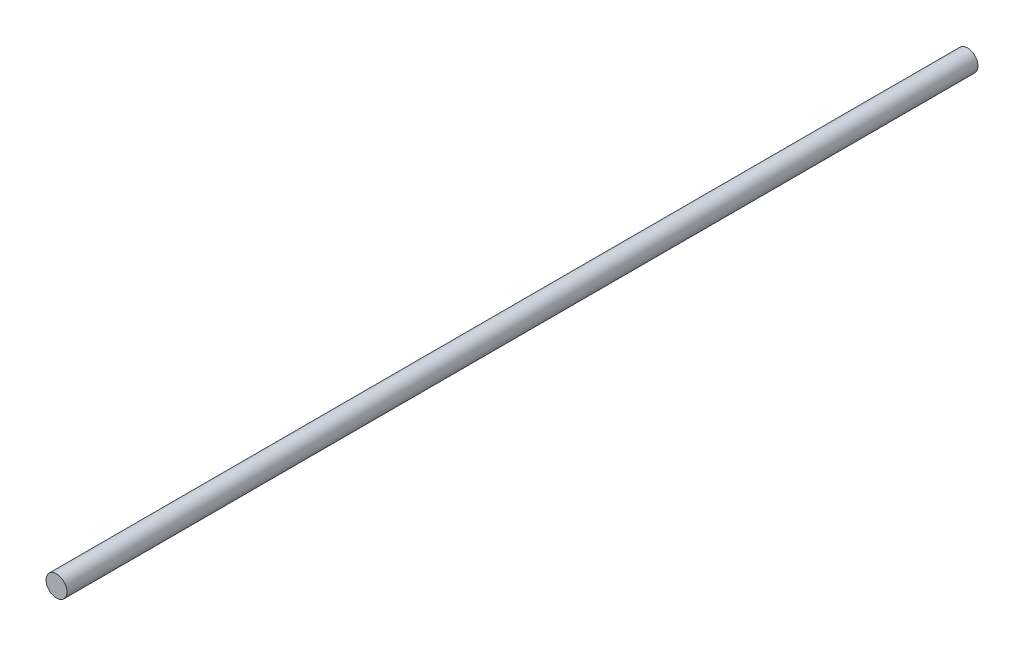
ISO-10303-21;
HEADER;
FILE_DESCRIPTION(('STEP AP214'),'2;1');
FILE_NAME('part.step','',(''),(''),'','','');
FILE_SCHEMA(('AUTOMOTIVE_DESIGN { 1 0 10303 214 1 1 1 1 }'));
ENDSEC;
DATA;
#1=APPLICATION_CONTEXT('core data for automotive mechanical design processes');
#2=APPLICATION_PROTOCOL_DEFINITION('international standard','automotive_design',2000,#1);
#3=PRODUCT_CONTEXT('',#1,'mechanical');
#4=PRODUCT('Part','Part','',(#3));
#5=PRODUCT_RELATED_PRODUCT_CATEGORY('part','',(#4));
#6=PRODUCT_DEFINITION_FORMATION('','',#4);
#7=PRODUCT_DEFINITION_CONTEXT('part definition',#1,'design');
#8=PRODUCT_DEFINITION('design','',#6,#7);
#9=PRODUCT_DEFINITION_SHAPE('','',#8);
#10=(LENGTH_UNIT() NAMED_UNIT(*) SI_UNIT(.MILLI.,.METRE.));
#11=(NAMED_UNIT(*) PLANE_ANGLE_UNIT() SI_UNIT($,.RADIAN.));
#12=(NAMED_UNIT(*) SI_UNIT($,.STERADIAN.) SOLID_ANGLE_UNIT());
#13=UNCERTAINTY_MEASURE_WITH_UNIT(LENGTH_MEASURE(1.E-05),#10,'distance_accuracy_value','');
#14=(GEOMETRIC_REPRESENTATION_CONTEXT(3) GLOBAL_UNCERTAINTY_ASSIGNED_CONTEXT((#13)) GLOBAL_UNIT_ASSIGNED_CONTEXT((#10,
#11,#12)) REPRESENTATION_CONTEXT('',''));
#15=CARTESIAN_POINT('',(0.,0.,0.));
#16=DIRECTION('',(0.,0.,1.));
#17=DIRECTION('',(1.,0.,0.));
#18=AXIS2_PLACEMENT_3D('',#15,#16,#17);
#19=CARTESIAN_POINT('',(0.,0.,260.));
#20=DIRECTION('',(0.,0.,-1.));
#21=DIRECTION('',(-1.,0.,0.));
#22=AXIS2_PLACEMENT_3D('',#19,#20,#21);
#23=CYLINDRICAL_SURFACE('',#22,3.);
#24=CARTESIAN_POINT('',(0.,0.,260.));
#25=DIRECTION('',(0.,0.,1.));
#26=DIRECTION('',(1.,0.,0.));
#27=AXIS2_PLACEMENT_3D('',#24,#25,#26);
#28=CIRCLE('',#27,3.);
#29=CARTESIAN_POINT('',(3.,0.,260.));
#30=VERTEX_POINT('',#29);
#31=EDGE_CURVE('E10',#30,#30,#28,.T.);
#32=ORIENTED_EDGE('',*,*,#31,.F.);
#33=EDGE_LOOP('',(#32));
#34=FACE_BOUND('',#33,.T.);
#35=CARTESIAN_POINT('',(0.,0.,0.));
#36=DIRECTION('',(0.,0.,1.));
#37=DIRECTION('',(1.,0.,0.));
#38=AXIS2_PLACEMENT_3D('',#35,#36,#37);
#39=CIRCLE('',#38,3.);
#40=CARTESIAN_POINT('',(3.,0.,0.));
#41=VERTEX_POINT('',#40);
#42=EDGE_CURVE('E46',#41,#41,#39,.T.);
#43=ORIENTED_EDGE('',*,*,#42,.T.);
#44=EDGE_LOOP('',(#43));
#45=FACE_BOUND('',#44,.T.);
#46=ADVANCED_FACE('F43',(#34,#45),#23,.T.);
#47=CARTESIAN_POINT('',(0.,0.,260.));
#48=DIRECTION('',(0.,0.,1.));
#49=DIRECTION('',(1.,0.,0.));
#50=AXIS2_PLACEMENT_3D('',#47,#48,#49);
#51=PLANE('',#50);
#52=ORIENTED_EDGE('',*,*,#31,.T.);
#53=EDGE_LOOP('',(#52));
#54=FACE_BOUND('',#53,.T.);
#55=ADVANCED_FACE('F60',(#54),#51,.T.);
#56=CARTESIAN_POINT('',(0.,0.,0.));
#57=DIRECTION('',(0.,0.,1.));
#58=DIRECTION('',(1.,0.,0.));
#59=AXIS2_PLACEMENT_3D('',#56,#57,#58);
#60=PLANE('',#59);
#61=ORIENTED_EDGE('',*,*,#42,.F.);
#62=EDGE_LOOP('',(#61));
#63=FACE_BOUND('',#62,.T.);
#64=ADVANCED_FACE('F58',(#63),#60,.F.);
#65=CLOSED_SHELL('',(#46,#55,#64));
#66=MANIFOLD_SOLID_BREP('B2',#65);
#67=ADVANCED_BREP_SHAPE_REPRESENTATION('',(#18,#66),#14);
#68=SHAPE_DEFINITION_REPRESENTATION(#9,#67);
ENDSEC;
END-ISO-10303-21;
